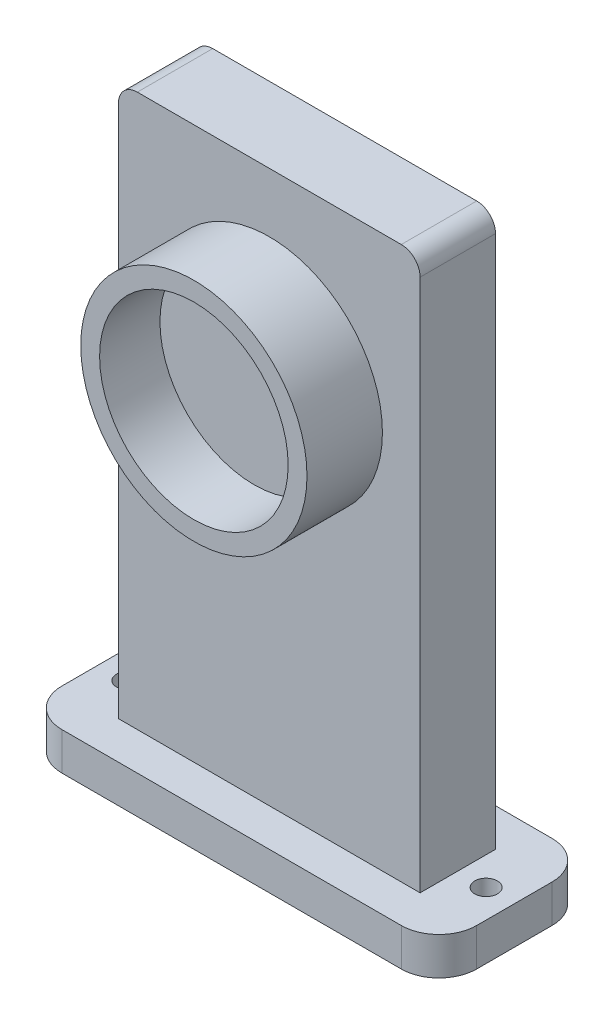
ISO-10303-21;
HEADER;
FILE_DESCRIPTION(('STEP AP214'),'2;1');
FILE_NAME('part.step','',(''),(''),'','','');
FILE_SCHEMA(('AUTOMOTIVE_DESIGN { 1 0 10303 214 1 1 1 1 }'));
ENDSEC;
DATA;
#1=APPLICATION_CONTEXT('core data for automotive mechanical design processes');
#2=APPLICATION_PROTOCOL_DEFINITION('international standard','automotive_design',2000,#1);
#3=PRODUCT_CONTEXT('',#1,'mechanical');
#4=PRODUCT('Part','Part','',(#3));
#5=PRODUCT_RELATED_PRODUCT_CATEGORY('part','',(#4));
#6=PRODUCT_DEFINITION_FORMATION('','',#4);
#7=PRODUCT_DEFINITION_CONTEXT('part definition',#1,'design');
#8=PRODUCT_DEFINITION('design','',#6,#7);
#9=PRODUCT_DEFINITION_SHAPE('','',#8);
#10=(LENGTH_UNIT() NAMED_UNIT(*) SI_UNIT(.MILLI.,.METRE.));
#11=(NAMED_UNIT(*) PLANE_ANGLE_UNIT() SI_UNIT($,.RADIAN.));
#12=(NAMED_UNIT(*) SI_UNIT($,.STERADIAN.) SOLID_ANGLE_UNIT());
#13=UNCERTAINTY_MEASURE_WITH_UNIT(LENGTH_MEASURE(1.E-05),#10,'distance_accuracy_value','');
#14=(GEOMETRIC_REPRESENTATION_CONTEXT(3) GLOBAL_UNCERTAINTY_ASSIGNED_CONTEXT((#13)) GLOBAL_UNIT_ASSIGNED_CONTEXT((#10,
#11,#12)) REPRESENTATION_CONTEXT('',''));
#15=CARTESIAN_POINT('',(0.,0.,0.));
#16=DIRECTION('',(0.,0.,1.));
#17=DIRECTION('',(1.,0.,0.));
#18=AXIS2_PLACEMENT_3D('',#15,#16,#17);
#19=CARTESIAN_POINT('',(20.,55.35,10.));
#20=DIRECTION('',(-1.,0.,0.));
#21=DIRECTION('',(0.,-1.,0.));
#22=AXIS2_PLACEMENT_3D('',#19,#20,#21);
#23=PLANE('',#22);
#24=DIRECTION('',(0.,1.,0.));
#25=VECTOR('',#24,1.);
#26=CARTESIAN_POINT('',(20.,55.35,10.));
#27=LINE('',#26,#25);
#28=CARTESIAN_POINT('',(20.,-50.35,10.));
#29=VERTEX_POINT('',#28);
#30=CARTESIAN_POINT('',(20.,20.35,10.));
#31=VERTEX_POINT('',#30);
#32=EDGE_CURVE('E147',#29,#31,#27,.T.);
#33=ORIENTED_EDGE('',*,*,#32,.F.);
#34=DIRECTION('',(0.,0.,1.));
#35=VECTOR('',#34,1.);
#36=CARTESIAN_POINT('',(20.,-50.35,10.));
#37=LINE('',#36,#35);
#38=CARTESIAN_POINT('',(20.,-50.35,0.));
#39=VERTEX_POINT('',#38);
#40=EDGE_CURVE('E135',#39,#29,#37,.T.);
#41=ORIENTED_EDGE('',*,*,#40,.F.);
#42=DIRECTION('',(0.,1.,0.));
#43=VECTOR('',#42,1.);
#44=CARTESIAN_POINT('',(20.,55.35,0.));
#45=LINE('',#44,#43);
#46=CARTESIAN_POINT('',(20.,20.35,0.));
#47=VERTEX_POINT('',#46);
#48=EDGE_CURVE('E159',#39,#47,#45,.T.);
#49=ORIENTED_EDGE('',*,*,#48,.T.);
#50=DIRECTION('',(0.,0.,-1.));
#51=VECTOR('',#50,1.);
#52=CARTESIAN_POINT('',(20.,20.35,10.));
#53=LINE('',#52,#51);
#54=EDGE_CURVE('E152',#47,#31,#53,.F.);
#55=ORIENTED_EDGE('',*,*,#54,.T.);
#56=EDGE_LOOP('',(#33,#41,#49,#55));
#57=FACE_BOUND('',#56,.T.);
#58=ADVANCED_FACE('F36',(#57),#23,.F.);
#59=CARTESIAN_POINT('',(-20.,55.35,10.));
#60=DIRECTION('',(1.,0.,0.));
#61=DIRECTION('',(0.,1.,0.));
#62=AXIS2_PLACEMENT_3D('',#59,#60,#61);
#63=PLANE('',#62);
#64=DIRECTION('',(0.,-1.,0.));
#65=VECTOR('',#64,1.);
#66=CARTESIAN_POINT('',(-20.,55.35,0.));
#67=LINE('',#66,#65);
#68=CARTESIAN_POINT('',(-20.,20.35,0.));
#69=VERTEX_POINT('',#68);
#70=CARTESIAN_POINT('',(-20.,-50.35,0.));
#71=VERTEX_POINT('',#70);
#72=EDGE_CURVE('E154',#69,#71,#67,.T.);
#73=ORIENTED_EDGE('',*,*,#72,.T.);
#74=DIRECTION('',(0.,0.,-1.));
#75=VECTOR('',#74,1.);
#76=CARTESIAN_POINT('',(-20.,-50.35,10.));
#77=LINE('',#76,#75);
#78=CARTESIAN_POINT('',(-20.,-50.35,10.));
#79=VERTEX_POINT('',#78);
#80=EDGE_CURVE('E51',#79,#71,#77,.T.);
#81=ORIENTED_EDGE('',*,*,#80,.F.);
#82=DIRECTION('',(0.,-1.,0.));
#83=VECTOR('',#82,1.);
#84=CARTESIAN_POINT('',(-20.,55.35,10.));
#85=LINE('',#84,#83);
#86=CARTESIAN_POINT('',(-20.,20.35,10.));
#87=VERTEX_POINT('',#86);
#88=EDGE_CURVE('E149',#87,#79,#85,.T.);
#89=ORIENTED_EDGE('',*,*,#88,.F.);
#90=DIRECTION('',(0.,0.,1.));
#91=VECTOR('',#90,1.);
#92=CARTESIAN_POINT('',(-20.,20.35,0.));
#93=LINE('',#92,#91);
#94=EDGE_CURVE('E11',#87,#69,#93,.F.);
#95=ORIENTED_EDGE('',*,*,#94,.T.);
#96=EDGE_LOOP('',(#73,#81,#89,#95));
#97=FACE_BOUND('',#96,.T.);
#98=ADVANCED_FACE('F215',(#97),#63,.F.);
#99=CARTESIAN_POINT('',(0.,0.,10.));
#100=DIRECTION('',(0.,0.,1.));
#101=DIRECTION('',(1.,0.,0.));
#102=AXIS2_PLACEMENT_3D('',#99,#100,#101);
#103=PLANE('',#102);
#104=DIRECTION('',(-1.,0.,0.));
#105=VECTOR('',#104,1.);
#106=CARTESIAN_POINT('',(-20.,-50.35,10.));
#107=LINE('',#106,#105);
#108=EDGE_CURVE('E139',#29,#79,#107,.T.);
#109=ORIENTED_EDGE('',*,*,#108,.F.);
#110=ORIENTED_EDGE('',*,*,#32,.T.);
#111=CARTESIAN_POINT('',(17.5,20.35,10.));
#112=DIRECTION('',(0.,0.,1.));
#113=DIRECTION('',(1.,0.,0.));
#114=AXIS2_PLACEMENT_3D('',#111,#112,#113);
#115=CIRCLE('',#114,2.5);
#116=CARTESIAN_POINT('',(17.5,22.85,10.));
#117=VERTEX_POINT('',#116);
#118=EDGE_CURVE('E44',#31,#117,#115,.T.);
#119=ORIENTED_EDGE('',*,*,#118,.T.);
#120=DIRECTION('',(1.,0.,0.));
#121=VECTOR('',#120,1.);
#122=CARTESIAN_POINT('',(-20.,22.85,10.));
#123=LINE('',#122,#121);
#124=CARTESIAN_POINT('',(-17.5,22.85,10.));
#125=VERTEX_POINT('',#124);
#126=EDGE_CURVE('E179',#125,#117,#123,.T.);
#127=ORIENTED_EDGE('',*,*,#126,.F.);
#128=CARTESIAN_POINT('',(-17.5,20.35,10.));
#129=DIRECTION('',(0.,0.,1.));
#130=DIRECTION('',(1.,0.,0.));
#131=AXIS2_PLACEMENT_3D('',#128,#129,#130);
#132=CIRCLE('',#131,2.5);
#133=EDGE_CURVE('E59',#125,#87,#132,.T.);
#134=ORIENTED_EDGE('',*,*,#133,.T.);
#135=ORIENTED_EDGE('',*,*,#88,.T.);
#136=EDGE_LOOP('',(#109,#110,#119,#127,#134,#135));
#137=FACE_BOUND('',#136,.T.);
#138=CARTESIAN_POINT('',(0.,0.,10.));
#139=DIRECTION('',(0.,0.,1.));
#140=DIRECTION('',(1.,0.,0.));
#141=AXIS2_PLACEMENT_3D('',#138,#139,#140);
#142=CIRCLE('',#141,15.);
#143=CARTESIAN_POINT('',(15.,0.,10.));
#144=VERTEX_POINT('',#143);
#145=EDGE_CURVE('E156',#144,#144,#142,.T.);
#146=ORIENTED_EDGE('',*,*,#145,.F.);
#147=EDGE_LOOP('',(#146));
#148=FACE_BOUND('',#147,.T.);
#149=ADVANCED_FACE('F145',(#137,#148),#103,.T.);
#150=CARTESIAN_POINT('',(0.,0.,0.));
#151=DIRECTION('',(0.,0.,1.));
#152=DIRECTION('',(1.,0.,0.));
#153=AXIS2_PLACEMENT_3D('',#150,#151,#152);
#154=PLANE('',#153);
#155=ORIENTED_EDGE('',*,*,#48,.F.);
#156=DIRECTION('',(1.,0.,0.));
#157=VECTOR('',#156,1.);
#158=CARTESIAN_POINT('',(-20.,-50.35,0.));
#159=LINE('',#158,#157);
#160=EDGE_CURVE('E140',#71,#39,#159,.T.);
#161=ORIENTED_EDGE('',*,*,#160,.F.);
#162=ORIENTED_EDGE('',*,*,#72,.F.);
#163=CARTESIAN_POINT('',(-17.5,20.35,0.));
#164=DIRECTION('',(0.,0.,1.));
#165=DIRECTION('',(1.,0.,0.));
#166=AXIS2_PLACEMENT_3D('',#163,#164,#165);
#167=CIRCLE('',#166,2.5);
#168=CARTESIAN_POINT('',(-17.5,22.85,0.));
#169=VERTEX_POINT('',#168);
#170=EDGE_CURVE('E172',#69,#169,#167,.F.);
#171=ORIENTED_EDGE('',*,*,#170,.T.);
#172=DIRECTION('',(-1.,0.,0.));
#173=VECTOR('',#172,1.);
#174=CARTESIAN_POINT('',(-20.,22.85,0.));
#175=LINE('',#174,#173);
#176=CARTESIAN_POINT('',(17.5,22.85,0.));
#177=VERTEX_POINT('',#176);
#178=EDGE_CURVE('E187',#177,#169,#175,.T.);
#179=ORIENTED_EDGE('',*,*,#178,.F.);
#180=CARTESIAN_POINT('',(17.5,20.35,0.));
#181=DIRECTION('',(0.,0.,1.));
#182=DIRECTION('',(1.,0.,0.));
#183=AXIS2_PLACEMENT_3D('',#180,#181,#182);
#184=CIRCLE('',#183,2.5);
#185=EDGE_CURVE('E174',#177,#47,#184,.F.);
#186=ORIENTED_EDGE('',*,*,#185,.T.);
#187=EDGE_LOOP('',(#155,#161,#162,#171,#179,#186));
#188=FACE_BOUND('',#187,.T.);
#189=ADVANCED_FACE('F192',(#188),#154,.F.);
#190=CARTESIAN_POINT('',(0.,0.,20.));
#191=DIRECTION('',(0.,0.,-1.));
#192=DIRECTION('',(-1.,0.,0.));
#193=AXIS2_PLACEMENT_3D('',#190,#191,#192);
#194=CYLINDRICAL_SURFACE('',#193,15.);
#195=CARTESIAN_POINT('',(0.,0.,20.));
#196=DIRECTION('',(0.,0.,1.));
#197=DIRECTION('',(1.,0.,0.));
#198=AXIS2_PLACEMENT_3D('',#195,#196,#197);
#199=CIRCLE('',#198,15.);
#200=CARTESIAN_POINT('',(15.,0.,20.));
#201=VERTEX_POINT('',#200);
#202=EDGE_CURVE('E164',#201,#201,#199,.T.);
#203=ORIENTED_EDGE('',*,*,#202,.F.);
#204=EDGE_LOOP('',(#203));
#205=FACE_BOUND('',#204,.T.);
#206=ORIENTED_EDGE('',*,*,#145,.T.);
#207=EDGE_LOOP('',(#206));
#208=FACE_BOUND('',#207,.T.);
#209=ADVANCED_FACE('F208',(#205,#208),#194,.T.);
#210=CARTESIAN_POINT('',(0.,0.,20.));
#211=DIRECTION('',(0.,0.,1.));
#212=DIRECTION('',(1.,0.,0.));
#213=AXIS2_PLACEMENT_3D('',#210,#211,#212);
#214=PLANE('',#213);
#215=CARTESIAN_POINT('',(0.,0.,20.));
#216=DIRECTION('',(0.,0.,1.));
#217=DIRECTION('',(1.,0.,0.));
#218=AXIS2_PLACEMENT_3D('',#215,#216,#217);
#219=CIRCLE('',#218,12.5);
#220=CARTESIAN_POINT('',(12.5,0.,20.));
#221=VERTEX_POINT('',#220);
#222=EDGE_CURVE('E195',#221,#221,#219,.T.);
#223=ORIENTED_EDGE('',*,*,#222,.F.);
#224=EDGE_LOOP('',(#223));
#225=FACE_BOUND('',#224,.T.);
#226=ORIENTED_EDGE('',*,*,#202,.T.);
#227=EDGE_LOOP('',(#226));
#228=FACE_BOUND('',#227,.T.);
#229=ADVANCED_FACE('F206',(#225,#228),#214,.T.);
#230=CARTESIAN_POINT('',(0.,0.,12.));
#231=DIRECTION('',(0.,0.,1.));
#232=DIRECTION('',(1.,0.,0.));
#233=AXIS2_PLACEMENT_3D('',#230,#231,#232);
#234=CYLINDRICAL_SURFACE('',#233,12.5);
#235=CARTESIAN_POINT('',(0.,0.,12.));
#236=DIRECTION('',(0.,0.,1.));
#237=DIRECTION('',(1.,0.,0.));
#238=AXIS2_PLACEMENT_3D('',#235,#236,#237);
#239=CIRCLE('',#238,12.5);
#240=CARTESIAN_POINT('',(12.5,0.,12.));
#241=VERTEX_POINT('',#240);
#242=EDGE_CURVE('E198',#241,#241,#239,.T.);
#243=ORIENTED_EDGE('',*,*,#242,.F.);
#244=EDGE_LOOP('',(#243));
#245=FACE_BOUND('',#244,.T.);
#246=ORIENTED_EDGE('',*,*,#222,.T.);
#247=EDGE_LOOP('',(#246));
#248=FACE_BOUND('',#247,.T.);
#249=ADVANCED_FACE('F241',(#245,#248),#234,.F.);
#250=CARTESIAN_POINT('',(0.,0.,12.));
#251=DIRECTION('',(0.,0.,1.));
#252=DIRECTION('',(1.,0.,0.));
#253=AXIS2_PLACEMENT_3D('',#250,#251,#252);
#254=PLANE('',#253);
#255=ORIENTED_EDGE('',*,*,#242,.T.);
#256=EDGE_LOOP('',(#255));
#257=FACE_BOUND('',#256,.T.);
#258=ADVANCED_FACE('F236',(#257),#254,.T.);
#259=CARTESIAN_POINT('',(0.,22.85,0.));
#260=DIRECTION('',(0.,1.,0.));
#261=DIRECTION('',(0.,0.,1.));
#262=AXIS2_PLACEMENT_3D('',#259,#260,#261);
#263=PLANE('',#262);
#264=ORIENTED_EDGE('',*,*,#126,.T.);
#265=DIRECTION('',(0.,0.,-1.));
#266=VECTOR('',#265,1.);
#267=CARTESIAN_POINT('',(17.5,22.85,0.));
#268=LINE('',#267,#266);
#269=EDGE_CURVE('E169',#117,#177,#268,.T.);
#270=ORIENTED_EDGE('',*,*,#269,.T.);
#271=ORIENTED_EDGE('',*,*,#178,.T.);
#272=DIRECTION('',(0.,0.,1.));
#273=VECTOR('',#272,1.);
#274=CARTESIAN_POINT('',(-17.5,22.85,10.));
#275=LINE('',#274,#273);
#276=EDGE_CURVE('E166',#169,#125,#275,.T.);
#277=ORIENTED_EDGE('',*,*,#276,.T.);
#278=EDGE_LOOP('',(#264,#270,#271,#277));
#279=FACE_BOUND('',#278,.T.);
#280=ADVANCED_FACE('F183',(#279),#263,.T.);
#281=CARTESIAN_POINT('',(17.5,20.35,0.));
#282=DIRECTION('',(0.,0.,1.));
#283=DIRECTION('',(1.,0.,0.));
#284=AXIS2_PLACEMENT_3D('',#281,#282,#283);
#285=CYLINDRICAL_SURFACE('',#284,2.5);
#286=ORIENTED_EDGE('',*,*,#118,.F.);
#287=ORIENTED_EDGE('',*,*,#54,.F.);
#288=ORIENTED_EDGE('',*,*,#185,.F.);
#289=ORIENTED_EDGE('',*,*,#269,.F.);
#290=EDGE_LOOP('',(#286,#287,#288,#289));
#291=FACE_BOUND('',#290,.T.);
#292=ADVANCED_FACE('F190',(#291),#285,.T.);
#293=CARTESIAN_POINT('',(-17.5,20.35,0.));
#294=DIRECTION('',(0.,0.,-1.));
#295=DIRECTION('',(-1.,0.,0.));
#296=AXIS2_PLACEMENT_3D('',#293,#294,#295);
#297=CYLINDRICAL_SURFACE('',#296,2.5);
#298=ORIENTED_EDGE('',*,*,#170,.F.);
#299=ORIENTED_EDGE('',*,*,#94,.F.);
#300=ORIENTED_EDGE('',*,*,#133,.F.);
#301=ORIENTED_EDGE('',*,*,#276,.F.);
#302=EDGE_LOOP('',(#298,#299,#300,#301));
#303=FACE_BOUND('',#302,.T.);
#304=ADVANCED_FACE('F38',(#303),#297,.T.);
#305=CARTESIAN_POINT('',(22.5,-50.35,10.));
#306=DIRECTION('',(0.,-1.,0.));
#307=DIRECTION('',(1.,0.,0.));
#308=AXIS2_PLACEMENT_3D('',#305,#306,#307);
#309=CYLINDRICAL_SURFACE('',#308,5.);
#310=CARTESIAN_POINT('',(22.5,-55.35,10.));
#311=DIRECTION('',(0.,-1.,0.));
#312=DIRECTION('',(-1.,0.,0.));
#313=AXIS2_PLACEMENT_3D('',#310,#311,#312);
#314=CIRCLE('',#313,5.);
#315=CARTESIAN_POINT('',(27.5,-55.35,10.));
#316=VERTEX_POINT('',#315);
#317=CARTESIAN_POINT('',(22.5,-55.35,15.));
#318=VERTEX_POINT('',#317);
#319=EDGE_CURVE('E441',#316,#318,#314,.T.);
#320=ORIENTED_EDGE('',*,*,#319,.F.);
#321=DIRECTION('',(0.,-1.,0.));
#322=VECTOR('',#321,1.);
#323=CARTESIAN_POINT('',(27.5,-50.35,10.));
#324=LINE('',#323,#322);
#325=CARTESIAN_POINT('',(27.5,-50.35,10.));
#326=VERTEX_POINT('',#325);
#327=EDGE_CURVE('E188',#326,#316,#324,.T.);
#328=ORIENTED_EDGE('',*,*,#327,.F.);
#329=CARTESIAN_POINT('',(22.5,-50.35,10.));
#330=DIRECTION('',(0.,-1.,0.));
#331=DIRECTION('',(-1.,0.,0.));
#332=AXIS2_PLACEMENT_3D('',#329,#330,#331);
#333=CIRCLE('',#332,5.);
#334=CARTESIAN_POINT('',(22.5,-50.35,15.));
#335=VERTEX_POINT('',#334);
#336=EDGE_CURVE('E471',#326,#335,#333,.T.);
#337=ORIENTED_EDGE('',*,*,#336,.T.);
#338=DIRECTION('',(0.,-1.,0.));
#339=VECTOR('',#338,1.);
#340=CARTESIAN_POINT('',(22.5,-50.35,15.));
#341=LINE('',#340,#339);
#342=EDGE_CURVE('E484',#335,#318,#341,.T.);
#343=ORIENTED_EDGE('',*,*,#342,.T.);
#344=EDGE_LOOP('',(#320,#328,#337,#343));
#345=FACE_BOUND('',#344,.T.);
#346=ADVANCED_FACE('F234',(#345),#309,.T.);
#347=CARTESIAN_POINT('',(27.5,-50.35,10.));
#348=DIRECTION('',(1.,0.,0.));
#349=DIRECTION('',(0.,1.,0.));
#350=AXIS2_PLACEMENT_3D('',#347,#348,#349);
#351=PLANE('',#350);
#352=DIRECTION('',(0.,0.,1.));
#353=VECTOR('',#352,1.);
#354=CARTESIAN_POINT('',(27.5,-55.35,10.));
#355=LINE('',#354,#353);
#356=CARTESIAN_POINT('',(27.5,-55.35,0.));
#357=VERTEX_POINT('',#356);
#358=EDGE_CURVE('E447',#357,#316,#355,.T.);
#359=ORIENTED_EDGE('',*,*,#358,.F.);
#360=DIRECTION('',(0.,-1.,0.));
#361=VECTOR('',#360,1.);
#362=CARTESIAN_POINT('',(27.5,-50.35,0.));
#363=LINE('',#362,#361);
#364=CARTESIAN_POINT('',(27.5,-50.35,0.));
#365=VERTEX_POINT('',#364);
#366=EDGE_CURVE('E473',#365,#357,#363,.T.);
#367=ORIENTED_EDGE('',*,*,#366,.F.);
#368=DIRECTION('',(0.,0.,1.));
#369=VECTOR('',#368,1.);
#370=CARTESIAN_POINT('',(27.5,-50.35,10.));
#371=LINE('',#370,#369);
#372=EDGE_CURVE('E455',#365,#326,#371,.T.);
#373=ORIENTED_EDGE('',*,*,#372,.T.);
#374=ORIENTED_EDGE('',*,*,#327,.T.);
#375=EDGE_LOOP('',(#359,#367,#373,#374));
#376=FACE_BOUND('',#375,.T.);
#377=ADVANCED_FACE('F309',(#376),#351,.T.);
#378=CARTESIAN_POINT('',(22.5,-50.35,0.));
#379=DIRECTION('',(0.,-1.,0.));
#380=DIRECTION('',(1.,0.,0.));
#381=AXIS2_PLACEMENT_3D('',#378,#379,#380);
#382=CYLINDRICAL_SURFACE('',#381,5.);
#383=CARTESIAN_POINT('',(22.5,-55.35,0.));
#384=DIRECTION('',(0.,-1.,0.));
#385=DIRECTION('',(1.,0.,0.));
#386=AXIS2_PLACEMENT_3D('',#383,#384,#385);
#387=CIRCLE('',#386,5.);
#388=CARTESIAN_POINT('',(22.5,-55.35,-5.));
#389=VERTEX_POINT('',#388);
#390=EDGE_CURVE('E468',#389,#357,#387,.T.);
#391=ORIENTED_EDGE('',*,*,#390,.F.);
#392=DIRECTION('',(0.,-1.,0.));
#393=VECTOR('',#392,1.);
#394=CARTESIAN_POINT('',(22.5,-50.35,-5.));
#395=LINE('',#394,#393);
#396=CARTESIAN_POINT('',(22.5,-50.35,-5.));
#397=VERTEX_POINT('',#396);
#398=EDGE_CURVE('E475',#397,#389,#395,.T.);
#399=ORIENTED_EDGE('',*,*,#398,.F.);
#400=CARTESIAN_POINT('',(22.5,-50.35,0.));
#401=DIRECTION('',(0.,-1.,0.));
#402=DIRECTION('',(1.,0.,0.));
#403=AXIS2_PLACEMENT_3D('',#400,#401,#402);
#404=CIRCLE('',#403,5.);
#405=EDGE_CURVE('E487',#397,#365,#404,.T.);
#406=ORIENTED_EDGE('',*,*,#405,.T.);
#407=ORIENTED_EDGE('',*,*,#366,.T.);
#408=EDGE_LOOP('',(#391,#399,#406,#407));
#409=FACE_BOUND('',#408,.T.);
#410=ADVANCED_FACE('F318',(#409),#382,.T.);
#411=CARTESIAN_POINT('',(-22.5,-50.35,-5.));
#412=DIRECTION('',(0.,0.,-1.));
#413=DIRECTION('',(-1.,0.,0.));
#414=AXIS2_PLACEMENT_3D('',#411,#412,#413);
#415=PLANE('',#414);
#416=DIRECTION('',(1.,0.,0.));
#417=VECTOR('',#416,1.);
#418=CARTESIAN_POINT('',(-22.5,-55.35,-5.));
#419=LINE('',#418,#417);
#420=CARTESIAN_POINT('',(-22.5,-55.35,-5.));
#421=VERTEX_POINT('',#420);
#422=EDGE_CURVE('E465',#421,#389,#419,.T.);
#423=ORIENTED_EDGE('',*,*,#422,.F.);
#424=DIRECTION('',(0.,-1.,0.));
#425=VECTOR('',#424,1.);
#426=CARTESIAN_POINT('',(-22.5,-50.35,-5.));
#427=LINE('',#426,#425);
#428=CARTESIAN_POINT('',(-22.5,-50.35,-5.));
#429=VERTEX_POINT('',#428);
#430=EDGE_CURVE('E477',#429,#421,#427,.T.);
#431=ORIENTED_EDGE('',*,*,#430,.F.);
#432=DIRECTION('',(1.,0.,0.));
#433=VECTOR('',#432,1.);
#434=CARTESIAN_POINT('',(-22.5,-50.35,-5.));
#435=LINE('',#434,#433);
#436=EDGE_CURVE('E490',#429,#397,#435,.T.);
#437=ORIENTED_EDGE('',*,*,#436,.T.);
#438=ORIENTED_EDGE('',*,*,#398,.T.);
#439=EDGE_LOOP('',(#423,#431,#437,#438));
#440=FACE_BOUND('',#439,.T.);
#441=ADVANCED_FACE('F328',(#440),#415,.T.);
#442=CARTESIAN_POINT('',(-22.5,-50.35,0.));
#443=DIRECTION('',(0.,-1.,0.));
#444=DIRECTION('',(1.,0.,0.));
#445=AXIS2_PLACEMENT_3D('',#442,#443,#444);
#446=CYLINDRICAL_SURFACE('',#445,5.);
#447=CARTESIAN_POINT('',(-22.5,-55.35,0.));
#448=DIRECTION('',(0.,-1.,0.));
#449=DIRECTION('',(1.,0.,0.));
#450=AXIS2_PLACEMENT_3D('',#447,#448,#449);
#451=CIRCLE('',#450,5.);
#452=CARTESIAN_POINT('',(-27.5,-55.35,0.));
#453=VERTEX_POINT('',#452);
#454=EDGE_CURVE('E462',#453,#421,#451,.T.);
#455=ORIENTED_EDGE('',*,*,#454,.F.);
#456=DIRECTION('',(0.,-1.,0.));
#457=VECTOR('',#456,1.);
#458=CARTESIAN_POINT('',(-27.5,-50.35,0.));
#459=LINE('',#458,#457);
#460=CARTESIAN_POINT('',(-27.5,-50.35,0.));
#461=VERTEX_POINT('',#460);
#462=EDGE_CURVE('E479',#461,#453,#459,.T.);
#463=ORIENTED_EDGE('',*,*,#462,.F.);
#464=CARTESIAN_POINT('',(-22.5,-50.35,0.));
#465=DIRECTION('',(0.,-1.,0.));
#466=DIRECTION('',(1.,0.,0.));
#467=AXIS2_PLACEMENT_3D('',#464,#465,#466);
#468=CIRCLE('',#467,5.);
#469=EDGE_CURVE('E493',#461,#429,#468,.T.);
#470=ORIENTED_EDGE('',*,*,#469,.T.);
#471=ORIENTED_EDGE('',*,*,#430,.T.);
#472=EDGE_LOOP('',(#455,#463,#470,#471));
#473=FACE_BOUND('',#472,.T.);
#474=ADVANCED_FACE('F338',(#473),#446,.T.);
#475=CARTESIAN_POINT('',(-27.5,-50.35,10.));
#476=DIRECTION('',(-1.,0.,0.));
#477=DIRECTION('',(0.,-1.,0.));
#478=AXIS2_PLACEMENT_3D('',#475,#476,#477);
#479=PLANE('',#478);
#480=DIRECTION('',(0.,0.,-1.));
#481=VECTOR('',#480,1.);
#482=CARTESIAN_POINT('',(-27.5,-55.35,10.));
#483=LINE('',#482,#481);
#484=CARTESIAN_POINT('',(-27.5,-55.35,10.));
#485=VERTEX_POINT('',#484);
#486=EDGE_CURVE('E459',#485,#453,#483,.T.);
#487=ORIENTED_EDGE('',*,*,#486,.F.);
#488=DIRECTION('',(0.,-1.,0.));
#489=VECTOR('',#488,1.);
#490=CARTESIAN_POINT('',(-27.5,-50.35,10.));
#491=LINE('',#490,#489);
#492=CARTESIAN_POINT('',(-27.5,-50.35,10.));
#493=VERTEX_POINT('',#492);
#494=EDGE_CURVE('E481',#493,#485,#491,.T.);
#495=ORIENTED_EDGE('',*,*,#494,.F.);
#496=DIRECTION('',(0.,0.,-1.));
#497=VECTOR('',#496,1.);
#498=CARTESIAN_POINT('',(-27.5,-50.35,10.));
#499=LINE('',#498,#497);
#500=EDGE_CURVE('E498',#493,#461,#499,.T.);
#501=ORIENTED_EDGE('',*,*,#500,.T.);
#502=ORIENTED_EDGE('',*,*,#462,.T.);
#503=EDGE_LOOP('',(#487,#495,#501,#502));
#504=FACE_BOUND('',#503,.T.);
#505=ADVANCED_FACE('F348',(#504),#479,.T.);
#506=CARTESIAN_POINT('',(-22.5,-50.35,10.));
#507=DIRECTION('',(0.,-1.,0.));
#508=DIRECTION('',(1.,0.,0.));
#509=AXIS2_PLACEMENT_3D('',#506,#507,#508);
#510=CYLINDRICAL_SURFACE('',#509,5.);
#511=CARTESIAN_POINT('',(-22.5,-55.35,10.));
#512=DIRECTION('',(0.,-1.,0.));
#513=DIRECTION('',(1.,0.,0.));
#514=AXIS2_PLACEMENT_3D('',#511,#512,#513);
#515=CIRCLE('',#514,5.);
#516=CARTESIAN_POINT('',(-22.5,-55.35,15.));
#517=VERTEX_POINT('',#516);
#518=EDGE_CURVE('E450',#517,#485,#515,.T.);
#519=ORIENTED_EDGE('',*,*,#518,.F.);
#520=DIRECTION('',(0.,-1.,0.));
#521=VECTOR('',#520,1.);
#522=CARTESIAN_POINT('',(-22.5,-50.35,15.));
#523=LINE('',#522,#521);
#524=CARTESIAN_POINT('',(-22.5,-50.35,15.));
#525=VERTEX_POINT('',#524);
#526=EDGE_CURVE('E483',#525,#517,#523,.T.);
#527=ORIENTED_EDGE('',*,*,#526,.F.);
#528=CARTESIAN_POINT('',(-22.5,-50.35,10.));
#529=DIRECTION('',(0.,-1.,0.));
#530=DIRECTION('',(1.,0.,0.));
#531=AXIS2_PLACEMENT_3D('',#528,#529,#530);
#532=CIRCLE('',#531,5.);
#533=EDGE_CURVE('E501',#525,#493,#532,.T.);
#534=ORIENTED_EDGE('',*,*,#533,.T.);
#535=ORIENTED_EDGE('',*,*,#494,.T.);
#536=EDGE_LOOP('',(#519,#527,#534,#535));
#537=FACE_BOUND('',#536,.T.);
#538=ADVANCED_FACE('F358',(#537),#510,.T.);
#539=CARTESIAN_POINT('',(-22.5,-50.35,15.));
#540=DIRECTION('',(0.,0.,1.));
#541=DIRECTION('',(1.,0.,0.));
#542=AXIS2_PLACEMENT_3D('',#539,#540,#541);
#543=PLANE('',#542);
#544=DIRECTION('',(-1.,0.,0.));
#545=VECTOR('',#544,1.);
#546=CARTESIAN_POINT('',(-22.5,-55.35,15.));
#547=LINE('',#546,#545);
#548=EDGE_CURVE('E444',#318,#517,#547,.T.);
#549=ORIENTED_EDGE('',*,*,#548,.F.);
#550=ORIENTED_EDGE('',*,*,#342,.F.);
#551=DIRECTION('',(-1.,0.,0.));
#552=VECTOR('',#551,1.);
#553=CARTESIAN_POINT('',(-22.5,-50.35,15.));
#554=LINE('',#553,#552);
#555=EDGE_CURVE('E504',#335,#525,#554,.T.);
#556=ORIENTED_EDGE('',*,*,#555,.T.);
#557=ORIENTED_EDGE('',*,*,#526,.T.);
#558=EDGE_LOOP('',(#549,#550,#556,#557));
#559=FACE_BOUND('',#558,.T.);
#560=ADVANCED_FACE('F368',(#559),#543,.T.);
#561=CARTESIAN_POINT('',(22.5,-50.35,10.));
#562=DIRECTION('',(0.,1.,0.));
#563=DIRECTION('',(-1.,0.,0.));
#564=AXIS2_PLACEMENT_3D('',#561,#562,#563);
#565=PLANE('',#564);
#566=ORIENTED_EDGE('',*,*,#40,.T.);
#567=ORIENTED_EDGE('',*,*,#108,.T.);
#568=ORIENTED_EDGE('',*,*,#80,.T.);
#569=ORIENTED_EDGE('',*,*,#160,.T.);
#570=EDGE_LOOP('',(#566,#567,#568,#569));
#571=FACE_BOUND('',#570,.T.);
#572=CARTESIAN_POINT('',(23.75,-50.35,4.99999999999993));
#573=DIRECTION('',(0.,-1.,0.));
#574=DIRECTION('',(-1.,0.,0.));
#575=AXIS2_PLACEMENT_3D('',#572,#573,#574);
#576=CIRCLE('',#575,1.5);
#577=CARTESIAN_POINT('',(22.25,-50.35,4.99999999999993));
#578=VERTEX_POINT('',#577);
#579=EDGE_CURVE('E508',#578,#578,#576,.T.);
#580=ORIENTED_EDGE('',*,*,#579,.T.);
#581=EDGE_LOOP('',(#580));
#582=FACE_BOUND('',#581,.T.);
#583=CARTESIAN_POINT('',(-23.75,-50.35,5.));
#584=DIRECTION('',(0.,-1.,0.));
#585=DIRECTION('',(1.,0.,0.));
#586=AXIS2_PLACEMENT_3D('',#583,#584,#585);
#587=CIRCLE('',#586,1.5);
#588=CARTESIAN_POINT('',(-22.25,-50.35,5.));
#589=VERTEX_POINT('',#588);
#590=EDGE_CURVE('E448',#589,#589,#587,.T.);
#591=ORIENTED_EDGE('',*,*,#590,.T.);
#592=EDGE_LOOP('',(#591));
#593=FACE_BOUND('',#592,.T.);
#594=ORIENTED_EDGE('',*,*,#336,.F.);
#595=ORIENTED_EDGE('',*,*,#372,.F.);
#596=ORIENTED_EDGE('',*,*,#405,.F.);
#597=ORIENTED_EDGE('',*,*,#436,.F.);
#598=ORIENTED_EDGE('',*,*,#469,.F.);
#599=ORIENTED_EDGE('',*,*,#500,.F.);
#600=ORIENTED_EDGE('',*,*,#533,.F.);
#601=ORIENTED_EDGE('',*,*,#555,.F.);
#602=EDGE_LOOP('',(#594,#595,#596,#597,#598,#599,#600,#601));
#603=FACE_BOUND('',#602,.T.);
#604=ADVANCED_FACE('F137',(#571,#582,#593,#603),#565,.T.);
#605=CARTESIAN_POINT('',(-23.75,-50.35,5.));
#606=DIRECTION('',(0.,-1.,0.));
#607=DIRECTION('',(1.,0.,0.));
#608=AXIS2_PLACEMENT_3D('',#605,#606,#607);
#609=CYLINDRICAL_SURFACE('',#608,1.5);
#610=ORIENTED_EDGE('',*,*,#590,.F.);
#611=EDGE_LOOP('',(#610));
#612=FACE_BOUND('',#611,.T.);
#613=CARTESIAN_POINT('',(-23.75,-55.35,5.));
#614=DIRECTION('',(0.,-1.,0.));
#615=DIRECTION('',(1.,0.,0.));
#616=AXIS2_PLACEMENT_3D('',#613,#614,#615);
#617=CIRCLE('',#616,1.5);
#618=CARTESIAN_POINT('',(-22.25,-55.35,5.));
#619=VERTEX_POINT('',#618);
#620=EDGE_CURVE('E436',#619,#619,#617,.T.);
#621=ORIENTED_EDGE('',*,*,#620,.T.);
#622=EDGE_LOOP('',(#621));
#623=FACE_BOUND('',#622,.T.);
#624=ADVANCED_FACE('F386',(#612,#623),#609,.F.);
#625=CARTESIAN_POINT('',(23.75,-50.35,4.99999999999993));
#626=DIRECTION('',(0.,-1.,0.));
#627=DIRECTION('',(1.,0.,0.));
#628=AXIS2_PLACEMENT_3D('',#625,#626,#627);
#629=CYLINDRICAL_SURFACE('',#628,1.5);
#630=ORIENTED_EDGE('',*,*,#579,.F.);
#631=EDGE_LOOP('',(#630));
#632=FACE_BOUND('',#631,.T.);
#633=CARTESIAN_POINT('',(23.75,-55.35,4.99999999999993));
#634=DIRECTION('',(0.,-1.,0.));
#635=DIRECTION('',(-1.,0.,0.));
#636=AXIS2_PLACEMENT_3D('',#633,#634,#635);
#637=CIRCLE('',#636,1.5);
#638=CARTESIAN_POINT('',(22.25,-55.35,4.99999999999993));
#639=VERTEX_POINT('',#638);
#640=EDGE_CURVE('E432',#639,#639,#637,.T.);
#641=ORIENTED_EDGE('',*,*,#640,.T.);
#642=EDGE_LOOP('',(#641));
#643=FACE_BOUND('',#642,.T.);
#644=ADVANCED_FACE('F395',(#632,#643),#629,.F.);
#645=CARTESIAN_POINT('',(-20.,-55.35,10.));
#646=DIRECTION('',(0.,1.,0.));
#647=DIRECTION('',(-1.,0.,0.));
#648=AXIS2_PLACEMENT_3D('',#645,#646,#647);
#649=PLANE('',#648);
#650=ORIENTED_EDGE('',*,*,#640,.F.);
#651=EDGE_LOOP('',(#650));
#652=FACE_BOUND('',#651,.T.);
#653=ORIENTED_EDGE('',*,*,#620,.F.);
#654=EDGE_LOOP('',(#653));
#655=FACE_BOUND('',#654,.T.);
#656=ORIENTED_EDGE('',*,*,#319,.T.);
#657=ORIENTED_EDGE('',*,*,#548,.T.);
#658=ORIENTED_EDGE('',*,*,#518,.T.);
#659=ORIENTED_EDGE('',*,*,#486,.T.);
#660=ORIENTED_EDGE('',*,*,#454,.T.);
#661=ORIENTED_EDGE('',*,*,#422,.T.);
#662=ORIENTED_EDGE('',*,*,#390,.T.);
#663=ORIENTED_EDGE('',*,*,#358,.T.);
#664=EDGE_LOOP('',(#656,#657,#658,#659,#660,#661,#662,#663));
#665=FACE_BOUND('',#664,.T.);
#666=ADVANCED_FACE('F405',(#652,#655,#665),#649,.F.);
#667=CLOSED_SHELL('',(#58,#98,#149,#189,#209,#229,#249,#258,#280,#292,#304,#346,#377,#410,#441,
#474,#505,#538,#560,#604,#624,#644,#666));
#668=MANIFOLD_SOLID_BREP('B2',#667);
#669=ADVANCED_BREP_SHAPE_REPRESENTATION('',(#18,#668),#14);
#670=SHAPE_DEFINITION_REPRESENTATION(#9,#669);
ENDSEC;
END-ISO-10303-21;
